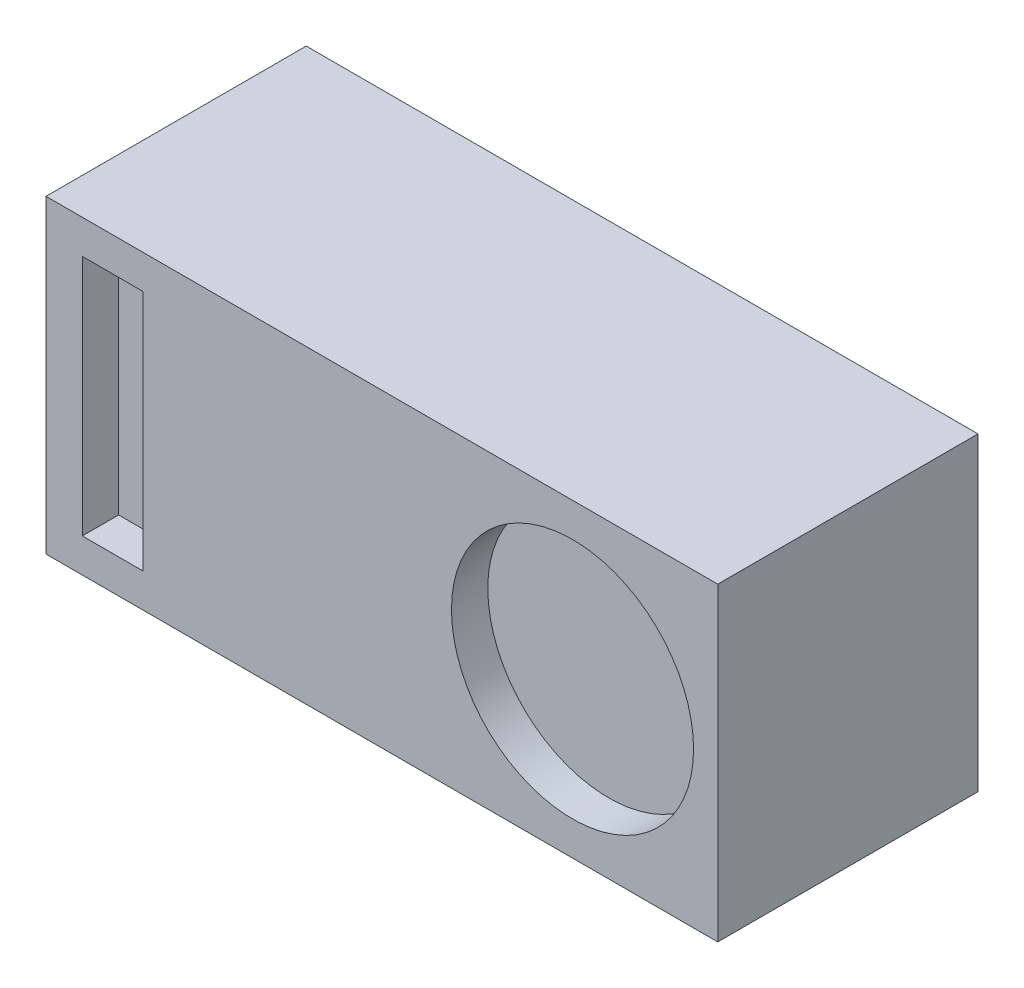
ISO-10303-21;
HEADER;
FILE_DESCRIPTION(('STEP AP214'),'2;1');
FILE_NAME('part.step','',(''),(''),'','','');
FILE_SCHEMA(('AUTOMOTIVE_DESIGN { 1 0 10303 214 1 1 1 1 }'));
ENDSEC;
DATA;
#1=APPLICATION_CONTEXT('core data for automotive mechanical design processes');
#2=APPLICATION_PROTOCOL_DEFINITION('international standard','automotive_design',2000,#1);
#3=PRODUCT_CONTEXT('',#1,'mechanical');
#4=PRODUCT('Part','Part','',(#3));
#5=PRODUCT_RELATED_PRODUCT_CATEGORY('part','',(#4));
#6=PRODUCT_DEFINITION_FORMATION('','',#4);
#7=PRODUCT_DEFINITION_CONTEXT('part definition',#1,'design');
#8=PRODUCT_DEFINITION('design','',#6,#7);
#9=PRODUCT_DEFINITION_SHAPE('','',#8);
#10=(LENGTH_UNIT() NAMED_UNIT(*) SI_UNIT(.MILLI.,.METRE.));
#11=(NAMED_UNIT(*) PLANE_ANGLE_UNIT() SI_UNIT($,.RADIAN.));
#12=(NAMED_UNIT(*) SI_UNIT($,.STERADIAN.) SOLID_ANGLE_UNIT());
#13=UNCERTAINTY_MEASURE_WITH_UNIT(LENGTH_MEASURE(1.E-05),#10,'distance_accuracy_value','');
#14=(GEOMETRIC_REPRESENTATION_CONTEXT(3) GLOBAL_UNCERTAINTY_ASSIGNED_CONTEXT((#13)) GLOBAL_UNIT_ASSIGNED_CONTEXT((#10,
#11,#12)) REPRESENTATION_CONTEXT('',''));
#15=CARTESIAN_POINT('',(0.,0.,0.));
#16=DIRECTION('',(0.,0.,1.));
#17=DIRECTION('',(1.,0.,0.));
#18=AXIS2_PLACEMENT_3D('',#15,#16,#17);
#19=CARTESIAN_POINT('',(15.75,0.,21.5));
#20=DIRECTION('',(0.,0.,-1.));
#21=DIRECTION('',(-1.,0.,0.));
#22=AXIS2_PLACEMENT_3D('',#19,#20,#21);
#23=CYLINDRICAL_SURFACE('',#22,10.);
#24=CARTESIAN_POINT('',(15.75,0.,21.5));
#25=DIRECTION('',(0.,0.,1.));
#26=DIRECTION('',(1.,0.,0.));
#27=AXIS2_PLACEMENT_3D('',#24,#25,#26);
#28=CIRCLE('',#27,10.);
#29=CARTESIAN_POINT('',(25.75,0.,21.5));
#30=VERTEX_POINT('',#29);
#31=EDGE_CURVE('E113',#30,#30,#28,.T.);
#32=ORIENTED_EDGE('',*,*,#31,.T.);
#33=EDGE_LOOP('',(#32));
#34=FACE_BOUND('',#33,.T.);
#35=CARTESIAN_POINT('',(15.75,0.,18.5));
#36=DIRECTION('',(0.,0.,-1.));
#37=DIRECTION('',(-1.,0.,0.));
#38=AXIS2_PLACEMENT_3D('',#35,#36,#37);
#39=CIRCLE('',#38,10.);
#40=CARTESIAN_POINT('',(5.75000000000001,0.,18.5));
#41=VERTEX_POINT('',#40);
#42=EDGE_CURVE('E106',#41,#41,#39,.T.);
#43=ORIENTED_EDGE('',*,*,#42,.T.);
#44=EDGE_LOOP('',(#43));
#45=FACE_BOUND('',#44,.T.);
#46=ADVANCED_FACE('F35',(#34,#45),#23,.F.);
#47=CARTESIAN_POINT('',(-24.75,10.,21.5));
#48=DIRECTION('',(1.,0.,0.));
#49=DIRECTION('',(0.,0.,-1.));
#50=AXIS2_PLACEMENT_3D('',#47,#48,#49);
#51=PLANE('',#50);
#52=DIRECTION('',(0.,0.,-1.));
#53=VECTOR('',#52,1.);
#54=CARTESIAN_POINT('',(-24.75,-10.,21.5));
#55=LINE('',#54,#53);
#56=CARTESIAN_POINT('',(-24.75,-10.,21.5));
#57=VERTEX_POINT('',#56);
#58=CARTESIAN_POINT('',(-24.75,-10.,18.5));
#59=VERTEX_POINT('',#58);
#60=EDGE_CURVE('E119',#57,#59,#55,.T.);
#61=ORIENTED_EDGE('',*,*,#60,.T.);
#62=DIRECTION('',(0.,1.,0.));
#63=VECTOR('',#62,1.);
#64=CARTESIAN_POINT('',(-24.75,0.,18.5));
#65=LINE('',#64,#63);
#66=CARTESIAN_POINT('',(-24.75,10.,18.5));
#67=VERTEX_POINT('',#66);
#68=EDGE_CURVE('E101',#59,#67,#65,.T.);
#69=ORIENTED_EDGE('',*,*,#68,.T.);
#70=DIRECTION('',(0.,0.,-1.));
#71=VECTOR('',#70,1.);
#72=CARTESIAN_POINT('',(-24.75,10.,21.5));
#73=LINE('',#72,#71);
#74=CARTESIAN_POINT('',(-24.75,10.,21.5));
#75=VERTEX_POINT('',#74);
#76=EDGE_CURVE('E123',#75,#67,#73,.T.);
#77=ORIENTED_EDGE('',*,*,#76,.F.);
#78=DIRECTION('',(0.,-1.,0.));
#79=VECTOR('',#78,1.);
#80=CARTESIAN_POINT('',(-24.75,10.,21.5));
#81=LINE('',#80,#79);
#82=EDGE_CURVE('E221',#75,#57,#81,.T.);
#83=ORIENTED_EDGE('',*,*,#82,.T.);
#84=EDGE_LOOP('',(#61,#69,#77,#83));
#85=FACE_BOUND('',#84,.T.);
#86=ADVANCED_FACE('F179',(#85),#51,.T.);
#87=CARTESIAN_POINT('',(-19.75,-10.,21.5));
#88=DIRECTION('',(0.,1.,0.));
#89=DIRECTION('',(0.,0.,1.));
#90=AXIS2_PLACEMENT_3D('',#87,#88,#89);
#91=PLANE('',#90);
#92=DIRECTION('',(0.,0.,-1.));
#93=VECTOR('',#92,1.);
#94=CARTESIAN_POINT('',(-19.75,-10.,21.5));
#95=LINE('',#94,#93);
#96=CARTESIAN_POINT('',(-19.75,-10.,21.5));
#97=VERTEX_POINT('',#96);
#98=CARTESIAN_POINT('',(-19.75,-10.,18.5));
#99=VERTEX_POINT('',#98);
#100=EDGE_CURVE('E111',#97,#99,#95,.T.);
#101=ORIENTED_EDGE('',*,*,#100,.T.);
#102=DIRECTION('',(1.,0.,0.));
#103=VECTOR('',#102,1.);
#104=CARTESIAN_POINT('',(0.,-10.,18.5));
#105=LINE('',#104,#103);
#106=EDGE_CURVE('E98',#59,#99,#105,.T.);
#107=ORIENTED_EDGE('',*,*,#106,.F.);
#108=ORIENTED_EDGE('',*,*,#60,.F.);
#109=DIRECTION('',(1.,0.,0.));
#110=VECTOR('',#109,1.);
#111=CARTESIAN_POINT('',(-19.75,-10.,21.5));
#112=LINE('',#111,#110);
#113=EDGE_CURVE('E118',#57,#97,#112,.T.);
#114=ORIENTED_EDGE('',*,*,#113,.T.);
#115=EDGE_LOOP('',(#101,#107,#108,#114));
#116=FACE_BOUND('',#115,.T.);
#117=ADVANCED_FACE('F116',(#116),#91,.T.);
#118=CARTESIAN_POINT('',(-19.75,10.,21.5));
#119=DIRECTION('',(-1.,0.,0.));
#120=DIRECTION('',(0.,-1.,0.));
#121=AXIS2_PLACEMENT_3D('',#118,#119,#120);
#122=PLANE('',#121);
#123=DIRECTION('',(0.,0.,-1.));
#124=VECTOR('',#123,1.);
#125=CARTESIAN_POINT('',(-19.75,10.,21.5));
#126=LINE('',#125,#124);
#127=CARTESIAN_POINT('',(-19.75,10.,21.5));
#128=VERTEX_POINT('',#127);
#129=CARTESIAN_POINT('',(-19.75,10.,18.5));
#130=VERTEX_POINT('',#129);
#131=EDGE_CURVE('E57',#128,#130,#126,.T.);
#132=ORIENTED_EDGE('',*,*,#131,.T.);
#133=DIRECTION('',(0.,1.,0.));
#134=VECTOR('',#133,1.);
#135=CARTESIAN_POINT('',(-19.75,0.,18.5));
#136=LINE('',#135,#134);
#137=EDGE_CURVE('E50',#99,#130,#136,.T.);
#138=ORIENTED_EDGE('',*,*,#137,.F.);
#139=ORIENTED_EDGE('',*,*,#100,.F.);
#140=DIRECTION('',(0.,1.,0.));
#141=VECTOR('',#140,1.);
#142=CARTESIAN_POINT('',(-19.75,10.,21.5));
#143=LINE('',#142,#141);
#144=EDGE_CURVE('E224',#97,#128,#143,.T.);
#145=ORIENTED_EDGE('',*,*,#144,.T.);
#146=EDGE_LOOP('',(#132,#138,#139,#145));
#147=FACE_BOUND('',#146,.T.);
#148=ADVANCED_FACE('F110',(#147),#122,.T.);
#149=CARTESIAN_POINT('',(-19.75,10.,21.5));
#150=DIRECTION('',(0.,-1.,0.));
#151=DIRECTION('',(0.,0.,-1.));
#152=AXIS2_PLACEMENT_3D('',#149,#150,#151);
#153=PLANE('',#152);
#154=ORIENTED_EDGE('',*,*,#76,.T.);
#155=DIRECTION('',(1.,0.,0.));
#156=VECTOR('',#155,1.);
#157=CARTESIAN_POINT('',(0.,10.,18.5));
#158=LINE('',#157,#156);
#159=EDGE_CURVE('E114',#67,#130,#158,.T.);
#160=ORIENTED_EDGE('',*,*,#159,.T.);
#161=ORIENTED_EDGE('',*,*,#131,.F.);
#162=DIRECTION('',(-1.,0.,0.));
#163=VECTOR('',#162,1.);
#164=CARTESIAN_POINT('',(-19.75,10.,21.5));
#165=LINE('',#164,#163);
#166=EDGE_CURVE('E226',#128,#75,#165,.T.);
#167=ORIENTED_EDGE('',*,*,#166,.T.);
#168=EDGE_LOOP('',(#154,#160,#161,#167));
#169=FACE_BOUND('',#168,.T.);
#170=ADVANCED_FACE('F192',(#169),#153,.T.);
#171=CARTESIAN_POINT('',(0.,0.,21.5));
#172=DIRECTION('',(0.,0.,-1.));
#173=DIRECTION('',(-1.,0.,0.));
#174=AXIS2_PLACEMENT_3D('',#171,#172,#173);
#175=PLANE('',#174);
#176=DIRECTION('',(0.,-1.,0.));
#177=VECTOR('',#176,1.);
#178=CARTESIAN_POINT('',(-27.75,12.8,21.5));
#179=LINE('',#178,#177);
#180=CARTESIAN_POINT('',(-27.75,12.8,21.5));
#181=VERTEX_POINT('',#180);
#182=CARTESIAN_POINT('',(-27.75,-12.8,21.5));
#183=VERTEX_POINT('',#182);
#184=EDGE_CURVE('E127',#181,#183,#179,.T.);
#185=ORIENTED_EDGE('',*,*,#184,.T.);
#186=DIRECTION('',(1.,0.,0.));
#187=VECTOR('',#186,1.);
#188=CARTESIAN_POINT('',(27.75,-12.8,21.5));
#189=LINE('',#188,#187);
#190=CARTESIAN_POINT('',(27.75,-12.8,21.5));
#191=VERTEX_POINT('',#190);
#192=EDGE_CURVE('E130',#183,#191,#189,.T.);
#193=ORIENTED_EDGE('',*,*,#192,.T.);
#194=DIRECTION('',(0.,1.,0.));
#195=VECTOR('',#194,1.);
#196=CARTESIAN_POINT('',(27.75,12.8,21.5));
#197=LINE('',#196,#195);
#198=CARTESIAN_POINT('',(27.75,12.8,21.5));
#199=VERTEX_POINT('',#198);
#200=EDGE_CURVE('E133',#191,#199,#197,.T.);
#201=ORIENTED_EDGE('',*,*,#200,.T.);
#202=DIRECTION('',(-1.,0.,0.));
#203=VECTOR('',#202,1.);
#204=CARTESIAN_POINT('',(27.75,12.8,21.5));
#205=LINE('',#204,#203);
#206=EDGE_CURVE('E135',#199,#181,#205,.T.);
#207=ORIENTED_EDGE('',*,*,#206,.T.);
#208=EDGE_LOOP('',(#185,#193,#201,#207));
#209=FACE_BOUND('',#208,.T.);
#210=ORIENTED_EDGE('',*,*,#82,.F.);
#211=ORIENTED_EDGE('',*,*,#166,.F.);
#212=ORIENTED_EDGE('',*,*,#144,.F.);
#213=ORIENTED_EDGE('',*,*,#113,.F.);
#214=EDGE_LOOP('',(#210,#211,#212,#213));
#215=FACE_BOUND('',#214,.T.);
#216=ORIENTED_EDGE('',*,*,#31,.F.);
#217=EDGE_LOOP('',(#216));
#218=FACE_BOUND('',#217,.T.);
#219=ADVANCED_FACE('F169',(#209,#215,#218),#175,.F.);
#220=CARTESIAN_POINT('',(0.,0.,0.));
#221=DIRECTION('',(0.,0.,-1.));
#222=DIRECTION('',(-1.,0.,0.));
#223=AXIS2_PLACEMENT_3D('',#220,#221,#222);
#224=PLANE('',#223);
#225=DIRECTION('',(0.,-1.,0.));
#226=VECTOR('',#225,1.);
#227=CARTESIAN_POINT('',(-27.75,12.8,0.));
#228=LINE('',#227,#226);
#229=CARTESIAN_POINT('',(-27.75,12.8,0.));
#230=VERTEX_POINT('',#229);
#231=CARTESIAN_POINT('',(-27.75,-12.8,0.));
#232=VERTEX_POINT('',#231);
#233=EDGE_CURVE('E121',#230,#232,#228,.T.);
#234=ORIENTED_EDGE('',*,*,#233,.F.);
#235=DIRECTION('',(-1.,0.,0.));
#236=VECTOR('',#235,1.);
#237=CARTESIAN_POINT('',(27.75,12.8,0.));
#238=LINE('',#237,#236);
#239=CARTESIAN_POINT('',(27.75,12.8,0.));
#240=VERTEX_POINT('',#239);
#241=EDGE_CURVE('E131',#240,#230,#238,.T.);
#242=ORIENTED_EDGE('',*,*,#241,.F.);
#243=DIRECTION('',(0.,1.,0.));
#244=VECTOR('',#243,1.);
#245=CARTESIAN_POINT('',(27.75,12.8,0.));
#246=LINE('',#245,#244);
#247=CARTESIAN_POINT('',(27.75,-12.8,0.));
#248=VERTEX_POINT('',#247);
#249=EDGE_CURVE('E142',#248,#240,#246,.T.);
#250=ORIENTED_EDGE('',*,*,#249,.F.);
#251=DIRECTION('',(1.,0.,0.));
#252=VECTOR('',#251,1.);
#253=CARTESIAN_POINT('',(27.75,-12.8,0.));
#254=LINE('',#253,#252);
#255=EDGE_CURVE('E140',#232,#248,#254,.T.);
#256=ORIENTED_EDGE('',*,*,#255,.F.);
#257=EDGE_LOOP('',(#234,#242,#250,#256));
#258=FACE_BOUND('',#257,.T.);
#259=ADVANCED_FACE('F160',(#258),#224,.T.);
#260=CARTESIAN_POINT('',(-27.75,12.8,21.5));
#261=DIRECTION('',(1.,0.,0.));
#262=DIRECTION('',(0.,0.,-1.));
#263=AXIS2_PLACEMENT_3D('',#260,#261,#262);
#264=PLANE('',#263);
#265=ORIENTED_EDGE('',*,*,#233,.T.);
#266=DIRECTION('',(0.,0.,-1.));
#267=VECTOR('',#266,1.);
#268=CARTESIAN_POINT('',(-27.75,-12.8,21.5));
#269=LINE('',#268,#267);
#270=EDGE_CURVE('E12',#183,#232,#269,.T.);
#271=ORIENTED_EDGE('',*,*,#270,.F.);
#272=ORIENTED_EDGE('',*,*,#184,.F.);
#273=DIRECTION('',(0.,0.,-1.));
#274=VECTOR('',#273,1.);
#275=CARTESIAN_POINT('',(-27.75,12.8,21.5));
#276=LINE('',#275,#274);
#277=EDGE_CURVE('E137',#181,#230,#276,.T.);
#278=ORIENTED_EDGE('',*,*,#277,.T.);
#279=EDGE_LOOP('',(#265,#271,#272,#278));
#280=FACE_BOUND('',#279,.T.);
#281=ADVANCED_FACE('F37',(#280),#264,.F.);
#282=CARTESIAN_POINT('',(27.75,-12.8,21.5));
#283=DIRECTION('',(0.,1.,0.));
#284=DIRECTION('',(0.,0.,1.));
#285=AXIS2_PLACEMENT_3D('',#282,#283,#284);
#286=PLANE('',#285);
#287=ORIENTED_EDGE('',*,*,#255,.T.);
#288=DIRECTION('',(0.,0.,-1.));
#289=VECTOR('',#288,1.);
#290=CARTESIAN_POINT('',(27.75,-12.8,21.5));
#291=LINE('',#290,#289);
#292=EDGE_CURVE('E43',#191,#248,#291,.T.);
#293=ORIENTED_EDGE('',*,*,#292,.F.);
#294=ORIENTED_EDGE('',*,*,#192,.F.);
#295=ORIENTED_EDGE('',*,*,#270,.T.);
#296=EDGE_LOOP('',(#287,#293,#294,#295));
#297=FACE_BOUND('',#296,.T.);
#298=ADVANCED_FACE('F171',(#297),#286,.F.);
#299=CARTESIAN_POINT('',(27.75,12.8,21.5));
#300=DIRECTION('',(-1.,0.,0.));
#301=DIRECTION('',(0.,0.,1.));
#302=AXIS2_PLACEMENT_3D('',#299,#300,#301);
#303=PLANE('',#302);
#304=ORIENTED_EDGE('',*,*,#249,.T.);
#305=DIRECTION('',(0.,0.,-1.));
#306=VECTOR('',#305,1.);
#307=CARTESIAN_POINT('',(27.75,12.8,21.5));
#308=LINE('',#307,#306);
#309=EDGE_CURVE('E147',#199,#240,#308,.T.);
#310=ORIENTED_EDGE('',*,*,#309,.F.);
#311=ORIENTED_EDGE('',*,*,#200,.F.);
#312=ORIENTED_EDGE('',*,*,#292,.T.);
#313=EDGE_LOOP('',(#304,#310,#311,#312));
#314=FACE_BOUND('',#313,.T.);
#315=ADVANCED_FACE('F154',(#314),#303,.F.);
#316=CARTESIAN_POINT('',(27.75,12.8,21.5));
#317=DIRECTION('',(0.,-1.,0.));
#318=DIRECTION('',(0.,0.,-1.));
#319=AXIS2_PLACEMENT_3D('',#316,#317,#318);
#320=PLANE('',#319);
#321=ORIENTED_EDGE('',*,*,#241,.T.);
#322=ORIENTED_EDGE('',*,*,#277,.F.);
#323=ORIENTED_EDGE('',*,*,#206,.F.);
#324=ORIENTED_EDGE('',*,*,#309,.T.);
#325=EDGE_LOOP('',(#321,#322,#323,#324));
#326=FACE_BOUND('',#325,.T.);
#327=ADVANCED_FACE('F163',(#326),#320,.F.);
#328=CARTESIAN_POINT('',(0.,0.,18.5));
#329=DIRECTION('',(0.,0.,-1.));
#330=DIRECTION('',(-1.,0.,0.));
#331=AXIS2_PLACEMENT_3D('',#328,#329,#330);
#332=PLANE('',#331);
#333=ORIENTED_EDGE('',*,*,#68,.F.);
#334=ORIENTED_EDGE('',*,*,#106,.T.);
#335=ORIENTED_EDGE('',*,*,#137,.T.);
#336=ORIENTED_EDGE('',*,*,#159,.F.);
#337=EDGE_LOOP('',(#333,#334,#335,#336));
#338=FACE_BOUND('',#337,.T.);
#339=ADVANCED_FACE('F99',(#338),#332,.F.);
#340=CARTESIAN_POINT('',(0.,0.,18.5));
#341=DIRECTION('',(0.,0.,-1.));
#342=DIRECTION('',(-1.,0.,0.));
#343=AXIS2_PLACEMENT_3D('',#340,#341,#342);
#344=PLANE('',#343);
#345=ORIENTED_EDGE('',*,*,#42,.F.);
#346=EDGE_LOOP('',(#345));
#347=FACE_BOUND('',#346,.T.);
#348=ADVANCED_FACE('F207',(#347),#344,.F.);
#349=CLOSED_SHELL('',(#46,#86,#117,#148,#170,#219,#259,#281,#298,#315,#327,#339,#348));
#350=MANIFOLD_SOLID_BREP('B2',#349);
#351=ADVANCED_BREP_SHAPE_REPRESENTATION('',(#18,#350),#14);
#352=SHAPE_DEFINITION_REPRESENTATION(#9,#351);
ENDSEC;
END-ISO-10303-21;
